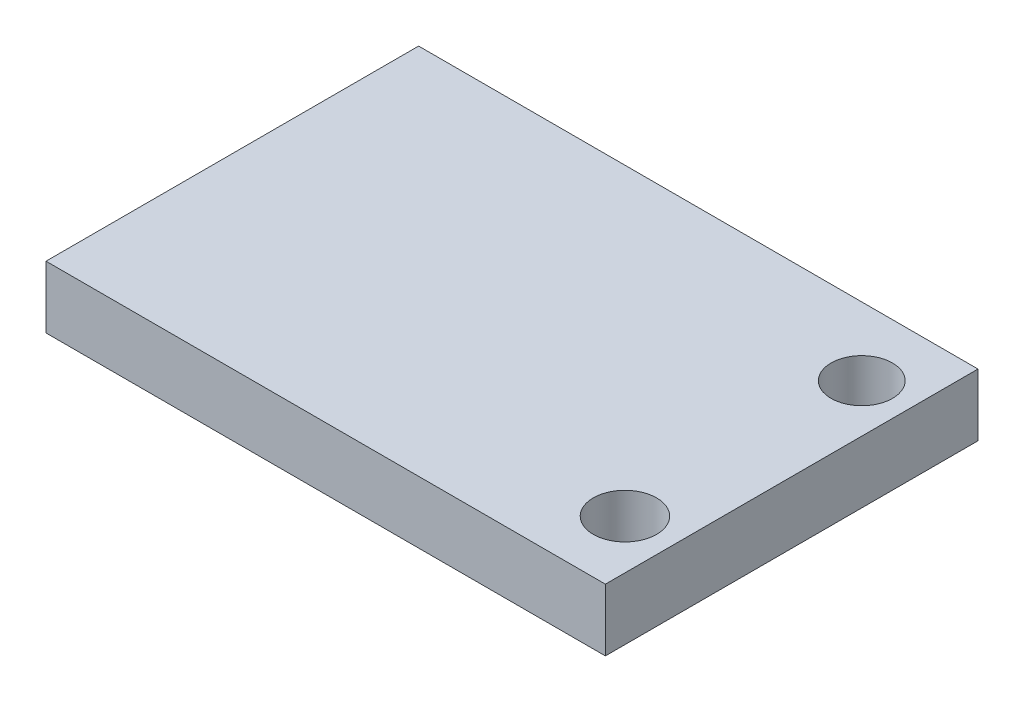
ISO-10303-21;
HEADER;
FILE_DESCRIPTION(('STEP AP214'),'2;1');
FILE_NAME('part.step','',(''),(''),'','','');
FILE_SCHEMA(('AUTOMOTIVE_DESIGN { 1 0 10303 214 1 1 1 1 }'));
ENDSEC;
DATA;
#1=APPLICATION_CONTEXT('core data for automotive mechanical design processes');
#2=APPLICATION_PROTOCOL_DEFINITION('international standard','automotive_design',2000,#1);
#3=PRODUCT_CONTEXT('',#1,'mechanical');
#4=PRODUCT('Part','Part','',(#3));
#5=PRODUCT_RELATED_PRODUCT_CATEGORY('part','',(#4));
#6=PRODUCT_DEFINITION_FORMATION('','',#4);
#7=PRODUCT_DEFINITION_CONTEXT('part definition',#1,'design');
#8=PRODUCT_DEFINITION('design','',#6,#7);
#9=PRODUCT_DEFINITION_SHAPE('','',#8);
#10=(LENGTH_UNIT() NAMED_UNIT(*) SI_UNIT(.MILLI.,.METRE.));
#11=(NAMED_UNIT(*) PLANE_ANGLE_UNIT() SI_UNIT($,.RADIAN.));
#12=(NAMED_UNIT(*) SI_UNIT($,.STERADIAN.) SOLID_ANGLE_UNIT());
#13=UNCERTAINTY_MEASURE_WITH_UNIT(LENGTH_MEASURE(1.E-05),#10,'distance_accuracy_value','');
#14=(GEOMETRIC_REPRESENTATION_CONTEXT(3) GLOBAL_UNCERTAINTY_ASSIGNED_CONTEXT((#13)) GLOBAL_UNIT_ASSIGNED_CONTEXT((#10,
#11,#12)) REPRESENTATION_CONTEXT('',''));
#15=CARTESIAN_POINT('',(0.,0.,0.));
#16=DIRECTION('',(0.,0.,1.));
#17=DIRECTION('',(1.,0.,0.));
#18=AXIS2_PLACEMENT_3D('',#15,#16,#17);
#19=CARTESIAN_POINT('',(0.,-12.7,-76.109285411475));
#20=DIRECTION('',(0.,0.,-1.));
#21=DIRECTION('',(-1.,0.,0.));
#22=AXIS2_PLACEMENT_3D('',#19,#20,#21);
#23=PLANE('',#22);
#24=DIRECTION('',(-1.,0.,0.));
#25=VECTOR('',#24,1.);
#26=CARTESIAN_POINT('',(0.,0.,-76.109285411475));
#27=LINE('',#26,#25);
#28=CARTESIAN_POINT('',(0.,0.,-76.109285411475));
#29=VERTEX_POINT('',#28);
#30=CARTESIAN_POINT('',(-114.261019043062,0.,-76.109285411475));
#31=VERTEX_POINT('',#30);
#32=EDGE_CURVE('E100',#29,#31,#27,.T.);
#33=ORIENTED_EDGE('',*,*,#32,.F.);
#34=DIRECTION('',(0.,1.,0.));
#35=VECTOR('',#34,1.);
#36=CARTESIAN_POINT('',(0.,-12.7,-76.109285411475));
#37=LINE('',#36,#35);
#38=CARTESIAN_POINT('',(0.,-12.7,-76.109285411475));
#39=VERTEX_POINT('',#38);
#40=EDGE_CURVE('E11',#39,#29,#37,.T.);
#41=ORIENTED_EDGE('',*,*,#40,.F.);
#42=DIRECTION('',(-1.,0.,0.));
#43=VECTOR('',#42,1.);
#44=CARTESIAN_POINT('',(0.,-12.7,-76.109285411475));
#45=LINE('',#44,#43);
#46=CARTESIAN_POINT('',(-114.261019043062,-12.7,-76.109285411475));
#47=VERTEX_POINT('',#46);
#48=EDGE_CURVE('E93',#39,#47,#45,.T.);
#49=ORIENTED_EDGE('',*,*,#48,.T.);
#50=DIRECTION('',(0.,1.,0.));
#51=VECTOR('',#50,1.);
#52=CARTESIAN_POINT('',(-114.261019043062,-12.7,-76.109285411475));
#53=LINE('',#52,#51);
#54=EDGE_CURVE('E90',#47,#31,#53,.T.);
#55=ORIENTED_EDGE('',*,*,#54,.T.);
#56=EDGE_LOOP('',(#33,#41,#49,#55));
#57=FACE_BOUND('',#56,.T.);
#58=ADVANCED_FACE('F33',(#57),#23,.T.);
#59=CARTESIAN_POINT('',(0.,-12.7,0.));
#60=DIRECTION('',(1.,0.,0.));
#61=DIRECTION('',(0.,0.,-1.));
#62=AXIS2_PLACEMENT_3D('',#59,#60,#61);
#63=PLANE('',#62);
#64=DIRECTION('',(0.,0.,-1.));
#65=VECTOR('',#64,1.);
#66=CARTESIAN_POINT('',(0.,0.,0.));
#67=LINE('',#66,#65);
#68=CARTESIAN_POINT('',(0.,0.,0.));
#69=VERTEX_POINT('',#68);
#70=EDGE_CURVE('E95',#69,#29,#67,.T.);
#71=ORIENTED_EDGE('',*,*,#70,.F.);
#72=DIRECTION('',(0.,1.,0.));
#73=VECTOR('',#72,1.);
#74=CARTESIAN_POINT('',(0.,-12.7,0.));
#75=LINE('',#74,#73);
#76=CARTESIAN_POINT('',(0.,-12.7,0.));
#77=VERTEX_POINT('',#76);
#78=EDGE_CURVE('E42',#77,#69,#75,.T.);
#79=ORIENTED_EDGE('',*,*,#78,.F.);
#80=DIRECTION('',(0.,0.,-1.));
#81=VECTOR('',#80,1.);
#82=CARTESIAN_POINT('',(0.,-12.7,0.));
#83=LINE('',#82,#81);
#84=EDGE_CURVE('E81',#77,#39,#83,.T.);
#85=ORIENTED_EDGE('',*,*,#84,.T.);
#86=ORIENTED_EDGE('',*,*,#40,.T.);
#87=EDGE_LOOP('',(#71,#79,#85,#86));
#88=FACE_BOUND('',#87,.T.);
#89=ADVANCED_FACE('F140',(#88),#63,.T.);
#90=CARTESIAN_POINT('',(0.,-12.7,0.));
#91=DIRECTION('',(0.,0.,-1.));
#92=DIRECTION('',(-1.,0.,0.));
#93=AXIS2_PLACEMENT_3D('',#90,#91,#92);
#94=PLANE('',#93);
#95=DIRECTION('',(-1.,0.,0.));
#96=VECTOR('',#95,1.);
#97=CARTESIAN_POINT('',(0.,0.,0.));
#98=LINE('',#97,#96);
#99=CARTESIAN_POINT('',(-114.261019043062,0.,0.));
#100=VERTEX_POINT('',#99);
#101=EDGE_CURVE('E86',#69,#100,#98,.T.);
#102=ORIENTED_EDGE('',*,*,#101,.T.);
#103=DIRECTION('',(0.,1.,0.));
#104=VECTOR('',#103,1.);
#105=CARTESIAN_POINT('',(-114.261019043062,-12.7,0.));
#106=LINE('',#105,#104);
#107=CARTESIAN_POINT('',(-114.261019043062,-12.7,0.));
#108=VERTEX_POINT('',#107);
#109=EDGE_CURVE('E84',#108,#100,#106,.T.);
#110=ORIENTED_EDGE('',*,*,#109,.F.);
#111=DIRECTION('',(-1.,0.,0.));
#112=VECTOR('',#111,1.);
#113=CARTESIAN_POINT('',(0.,-12.7,0.));
#114=LINE('',#113,#112);
#115=EDGE_CURVE('E78',#77,#108,#114,.T.);
#116=ORIENTED_EDGE('',*,*,#115,.F.);
#117=ORIENTED_EDGE('',*,*,#78,.T.);
#118=EDGE_LOOP('',(#102,#110,#116,#117));
#119=FACE_BOUND('',#118,.T.);
#120=ADVANCED_FACE('F85',(#119),#94,.F.);
#121=CARTESIAN_POINT('',(-114.261019043062,-12.7,0.));
#122=DIRECTION('',(1.,0.,0.));
#123=DIRECTION('',(0.,0.,-1.));
#124=AXIS2_PLACEMENT_3D('',#121,#122,#123);
#125=PLANE('',#124);
#126=DIRECTION('',(0.,0.,-1.));
#127=VECTOR('',#126,1.);
#128=CARTESIAN_POINT('',(-114.261019043062,0.,0.));
#129=LINE('',#128,#127);
#130=EDGE_CURVE('E103',#100,#31,#129,.T.);
#131=ORIENTED_EDGE('',*,*,#130,.T.);
#132=ORIENTED_EDGE('',*,*,#54,.F.);
#133=DIRECTION('',(0.,0.,-1.));
#134=VECTOR('',#133,1.);
#135=CARTESIAN_POINT('',(-114.261019043062,-12.7,0.));
#136=LINE('',#135,#134);
#137=EDGE_CURVE('E75',#108,#47,#136,.T.);
#138=ORIENTED_EDGE('',*,*,#137,.F.);
#139=ORIENTED_EDGE('',*,*,#109,.T.);
#140=EDGE_LOOP('',(#131,#132,#138,#139));
#141=FACE_BOUND('',#140,.T.);
#142=ADVANCED_FACE('F92',(#141),#125,.F.);
#143=CARTESIAN_POINT('',(0.,-12.7,0.));
#144=DIRECTION('',(0.,-1.,0.));
#145=DIRECTION('',(0.,0.,-1.));
#146=AXIS2_PLACEMENT_3D('',#143,#144,#145);
#147=PLANE('',#146);
#148=CARTESIAN_POINT('',(-9.80844033975376,-12.7,-62.1763364706688));
#149=DIRECTION('',(0.,-1.,0.));
#150=DIRECTION('',(0.,0.,-1.));
#151=AXIS2_PLACEMENT_3D('',#148,#149,#150);
#152=CIRCLE('',#151,6.2727808844973);
#153=CARTESIAN_POINT('',(-9.80844033975376,-12.7,-68.4491173551661));
#154=VERTEX_POINT('',#153);
#155=EDGE_CURVE('E118',#154,#154,#152,.T.);
#156=ORIENTED_EDGE('',*,*,#155,.F.);
#157=EDGE_LOOP('',(#156));
#158=FACE_BOUND('',#157,.T.);
#159=CARTESIAN_POINT('',(-10.0356643196097,-12.7,-14.0296592719964));
#160=DIRECTION('',(0.,-1.,0.));
#161=DIRECTION('',(0.,0.,-1.));
#162=AXIS2_PLACEMENT_3D('',#159,#160,#161);
#163=CIRCLE('',#162,6.46543896687839);
#164=CARTESIAN_POINT('',(-10.0356643196097,-12.7,-20.4950982388748));
#165=VERTEX_POINT('',#164);
#166=EDGE_CURVE('E111',#165,#165,#163,.T.);
#167=ORIENTED_EDGE('',*,*,#166,.F.);
#168=EDGE_LOOP('',(#167));
#169=FACE_BOUND('',#168,.T.);
#170=ORIENTED_EDGE('',*,*,#48,.F.);
#171=ORIENTED_EDGE('',*,*,#84,.F.);
#172=ORIENTED_EDGE('',*,*,#115,.T.);
#173=ORIENTED_EDGE('',*,*,#137,.T.);
#174=EDGE_LOOP('',(#170,#171,#172,#173));
#175=FACE_BOUND('',#174,.T.);
#176=ADVANCED_FACE('F80',(#158,#169,#175),#147,.T.);
#177=CARTESIAN_POINT('',(0.,0.,0.));
#178=DIRECTION('',(0.,-1.,0.));
#179=DIRECTION('',(0.,0.,-1.));
#180=AXIS2_PLACEMENT_3D('',#177,#178,#179);
#181=PLANE('',#180);
#182=CARTESIAN_POINT('',(-9.80844033975376,0.,-62.1763364706688));
#183=DIRECTION('',(0.,-1.,0.));
#184=DIRECTION('',(0.,0.,-1.));
#185=AXIS2_PLACEMENT_3D('',#182,#183,#184);
#186=CIRCLE('',#185,6.2727808844973);
#187=CARTESIAN_POINT('',(-9.80844033975376,0.,-68.4491173551661));
#188=VERTEX_POINT('',#187);
#189=EDGE_CURVE('E36',#188,#188,#186,.T.);
#190=ORIENTED_EDGE('',*,*,#189,.T.);
#191=EDGE_LOOP('',(#190));
#192=FACE_BOUND('',#191,.T.);
#193=CARTESIAN_POINT('',(-10.0356643196097,0.,-14.0296592719964));
#194=DIRECTION('',(0.,-1.,0.));
#195=DIRECTION('',(0.,0.,-1.));
#196=AXIS2_PLACEMENT_3D('',#193,#194,#195);
#197=CIRCLE('',#196,6.46543896687839);
#198=CARTESIAN_POINT('',(-10.0356643196097,0.,-20.4950982388748));
#199=VERTEX_POINT('',#198);
#200=EDGE_CURVE('E104',#199,#199,#197,.T.);
#201=ORIENTED_EDGE('',*,*,#200,.T.);
#202=EDGE_LOOP('',(#201));
#203=FACE_BOUND('',#202,.T.);
#204=ORIENTED_EDGE('',*,*,#32,.T.);
#205=ORIENTED_EDGE('',*,*,#130,.F.);
#206=ORIENTED_EDGE('',*,*,#101,.F.);
#207=ORIENTED_EDGE('',*,*,#70,.T.);
#208=EDGE_LOOP('',(#204,#205,#206,#207));
#209=FACE_BOUND('',#208,.T.);
#210=ADVANCED_FACE('F128',(#192,#203,#209),#181,.F.);
#211=CARTESIAN_POINT('',(-10.0356643196097,15.494,-14.0296592719964));
#212=DIRECTION('',(0.,-1.,0.));
#213=DIRECTION('',(0.,0.,-1.));
#214=AXIS2_PLACEMENT_3D('',#211,#212,#213);
#215=CYLINDRICAL_SURFACE('',#214,6.46543896687839);
#216=CARTESIAN_POINT('',(-10.0356643196097,-12.7,-20.4950982388748));
#217=CARTESIAN_POINT('',(-10.0356643196097,-12.5677083333333,-20.4950982388748));
#218=CARTESIAN_POINT('',(-10.0356643196097,-12.4354166666667,-20.4950982388748));
#219=CARTESIAN_POINT('',(-10.0356643196097,-12.1708333333333,-20.4950982388748));
#220=CARTESIAN_POINT('',(-10.0356643196097,-12.0385416666667,-20.4950982388748));
#221=CARTESIAN_POINT('',(-10.0356643196097,-11.7739583333333,-20.4950982388748));
#222=CARTESIAN_POINT('',(-10.0356643196097,-11.6416666666667,-20.4950982388748));
#223=CARTESIAN_POINT('',(-10.0356643196097,-11.3770833333333,-20.4950982388748));
#224=CARTESIAN_POINT('',(-10.0356643196097,-11.2447916666667,-20.4950982388748));
#225=CARTESIAN_POINT('',(-10.0356643196097,-10.9802083333333,-20.4950982388748));
#226=CARTESIAN_POINT('',(-10.0356643196097,-10.8479166666667,-20.4950982388748));
#227=CARTESIAN_POINT('',(-10.0356643196097,-10.5833333333333,-20.4950982388748));
#228=CARTESIAN_POINT('',(-10.0356643196097,-10.4510416666667,-20.4950982388748));
#229=CARTESIAN_POINT('',(-10.0356643196097,-10.1864583333333,-20.4950982388748));
#230=CARTESIAN_POINT('',(-10.0356643196097,-10.0541666666667,-20.4950982388748));
#231=CARTESIAN_POINT('',(-10.0356643196097,-9.78958333333334,-20.4950982388748));
#232=CARTESIAN_POINT('',(-10.0356643196097,-9.65729166666667,-20.4950982388748));
#233=CARTESIAN_POINT('',(-10.0356643196097,-9.39270833333334,-20.4950982388748));
#234=CARTESIAN_POINT('',(-10.0356643196097,-9.26041666666667,-20.4950982388748));
#235=CARTESIAN_POINT('',(-10.0356643196097,-8.99583333333334,-20.4950982388748));
#236=CARTESIAN_POINT('',(-10.0356643196097,-8.86354166666667,-20.4950982388748));
#237=CARTESIAN_POINT('',(-10.0356643196097,-8.59895833333334,-20.4950982388748));
#238=CARTESIAN_POINT('',(-10.0356643196097,-8.46666666666667,-20.4950982388748));
#239=CARTESIAN_POINT('',(-10.0356643196097,-8.20208333333334,-20.4950982388748));
#240=CARTESIAN_POINT('',(-10.0356643196097,-8.06979166666667,-20.4950982388748));
#241=CARTESIAN_POINT('',(-10.0356643196097,-7.80520833333334,-20.4950982388748));
#242=CARTESIAN_POINT('',(-10.0356643196097,-7.67291666666667,-20.4950982388748));
#243=CARTESIAN_POINT('',(-10.0356643196097,-7.40833333333334,-20.4950982388748));
#244=CARTESIAN_POINT('',(-10.0356643196097,-7.27604166666667,-20.4950982388748));
#245=CARTESIAN_POINT('',(-10.0356643196097,-7.01145833333334,-20.4950982388748));
#246=CARTESIAN_POINT('',(-10.0356643196097,-6.87916666666667,-20.4950982388748));
#247=CARTESIAN_POINT('',(-10.0356643196097,-6.61458333333333,-20.4950982388748));
#248=CARTESIAN_POINT('',(-10.0356643196097,-6.48229166666667,-20.4950982388748));
#249=CARTESIAN_POINT('',(-10.0356643196097,-6.21770833333334,-20.4950982388748));
#250=CARTESIAN_POINT('',(-10.0356643196097,-6.08541666666667,-20.4950982388748));
#251=CARTESIAN_POINT('',(-10.0356643196097,-5.82083333333333,-20.4950982388748));
#252=CARTESIAN_POINT('',(-10.0356643196097,-5.68854166666667,-20.4950982388748));
#253=CARTESIAN_POINT('',(-10.0356643196097,-5.42395833333333,-20.4950982388748));
#254=CARTESIAN_POINT('',(-10.0356643196097,-5.29166666666667,-20.4950982388748));
#255=CARTESIAN_POINT('',(-10.0356643196097,-5.02708333333334,-20.4950982388748));
#256=CARTESIAN_POINT('',(-10.0356643196097,-4.89479166666667,-20.4950982388748));
#257=CARTESIAN_POINT('',(-10.0356643196097,-4.63020833333333,-20.4950982388748));
#258=CARTESIAN_POINT('',(-10.0356643196097,-4.49791666666667,-20.4950982388748));
#259=CARTESIAN_POINT('',(-10.0356643196097,-4.23333333333333,-20.4950982388748));
#260=CARTESIAN_POINT('',(-10.0356643196097,-4.10104166666667,-20.4950982388748));
#261=CARTESIAN_POINT('',(-10.0356643196097,-3.83645833333333,-20.4950982388748));
#262=CARTESIAN_POINT('',(-10.0356643196097,-3.70416666666667,-20.4950982388748));
#263=CARTESIAN_POINT('',(-10.0356643196097,-3.43958333333333,-20.4950982388748));
#264=CARTESIAN_POINT('',(-10.0356643196097,-3.30729166666667,-20.4950982388748));
#265=CARTESIAN_POINT('',(-10.0356643196097,-3.04270833333333,-20.4950982388748));
#266=CARTESIAN_POINT('',(-10.0356643196097,-2.91041666666667,-20.4950982388748));
#267=CARTESIAN_POINT('',(-10.0356643196097,-2.64583333333333,-20.4950982388748));
#268=CARTESIAN_POINT('',(-10.0356643196097,-2.51354166666667,-20.4950982388748));
#269=CARTESIAN_POINT('',(-10.0356643196097,-2.24895833333333,-20.4950982388748));
#270=CARTESIAN_POINT('',(-10.0356643196097,-2.11666666666667,-20.4950982388748));
#271=CARTESIAN_POINT('',(-10.0356643196097,-1.85208333333333,-20.4950982388748));
#272=CARTESIAN_POINT('',(-10.0356643196097,-1.71979166666667,-20.4950982388748));
#273=CARTESIAN_POINT('',(-10.0356643196097,-1.45520833333333,-20.4950982388748));
#274=CARTESIAN_POINT('',(-10.0356643196097,-1.32291666666667,-20.4950982388748));
#275=CARTESIAN_POINT('',(-10.0356643196097,-1.05833333333333,-20.4950982388748));
#276=CARTESIAN_POINT('',(-10.0356643196097,-0.926041666666665,-20.4950982388748));
#277=CARTESIAN_POINT('',(-10.0356643196097,-0.661458333333332,-20.4950982388748));
#278=CARTESIAN_POINT('',(-10.0356643196097,-0.529166666666666,-20.4950982388748));
#279=CARTESIAN_POINT('',(-10.0356643196097,-0.264583333333333,-20.4950982388748));
#280=CARTESIAN_POINT('',(-10.0356643196097,-0.132291666666667,-20.4950982388748));
#281=CARTESIAN_POINT('',(-10.0356643196097,0.,-20.4950982388748));
#282=B_SPLINE_CURVE_WITH_KNOTS('',3,(#216,#217,#218,#219,#220,#221,#222,#223,#224,#225,#226,
#227,#228,#229,#230,#231,#232,#233,#234,#235,#236,#237,#238,#239,#240,#241,#242,#243,#244,#245,
#246,#247,#248,#249,#250,#251,#252,#253,#254,#255,#256,#257,#258,#259,#260,#261,#262,#263,#264,
#265,#266,#267,#268,#269,#270,#271,#272,#273,#274,#275,#276,#277,#278,#279,#280,#281),
.UNSPECIFIED.,.F.,.F.,(4,2,2,2,2,2,2,2,2,2,2,2,2,2,2,2,2,2,2,2,2,2,2,2,2,2,2,2,2,2,2,2,4),(0.,
0.396875000000001,0.793749999999999,1.190625,1.5875,1.984375,2.38125,2.778125,3.175,3.571875,
3.96875,4.365625,4.7625,5.159375,5.55625,5.953125,6.35,6.746875,7.14375,7.540625,7.9375,
8.334375,8.73125,9.128125,9.52500000000001,9.921875,10.31875,10.715625,11.1125,11.509375,
11.90625,12.303125,12.7),.UNSPECIFIED.);
#283=EDGE_CURVE('BSEAM134',#165,#199,#282,.T.);
#284=ORIENTED_EDGE('',*,*,#166,.T.);
#285=ORIENTED_EDGE('',*,*,#200,.F.);
#286=ORIENTED_EDGE('',*,*,#283,.T.);
#287=ORIENTED_EDGE('',*,*,#283,.F.);
#288=EDGE_LOOP('',(#284,#286,#285,#287));
#289=FACE_BOUND('',#288,.T.);
#290=ADVANCED_FACE('F134',(#289),#215,.F.);
#291=CARTESIAN_POINT('',(-9.80844033975376,18.542,-62.1763364706688));
#292=DIRECTION('',(0.,-1.,0.));
#293=DIRECTION('',(0.,0.,-1.));
#294=AXIS2_PLACEMENT_3D('',#291,#292,#293);
#295=CYLINDRICAL_SURFACE('',#294,6.2727808844973);
#296=ORIENTED_EDGE('',*,*,#155,.T.);
#297=EDGE_LOOP('',(#296));
#298=FACE_BOUND('',#297,.T.);
#299=ORIENTED_EDGE('',*,*,#189,.F.);
#300=EDGE_LOOP('',(#299));
#301=FACE_BOUND('',#300,.T.);
#302=ADVANCED_FACE('F123',(#298,#301),#295,.F.);
#303=CLOSED_SHELL('',(#58,#89,#120,#142,#176,#210,#290,#302));
#304=MANIFOLD_SOLID_BREP('B2',#303);
#305=ADVANCED_BREP_SHAPE_REPRESENTATION('',(#18,#304),#14);
#306=SHAPE_DEFINITION_REPRESENTATION(#9,#305);
ENDSEC;
END-ISO-10303-21;
